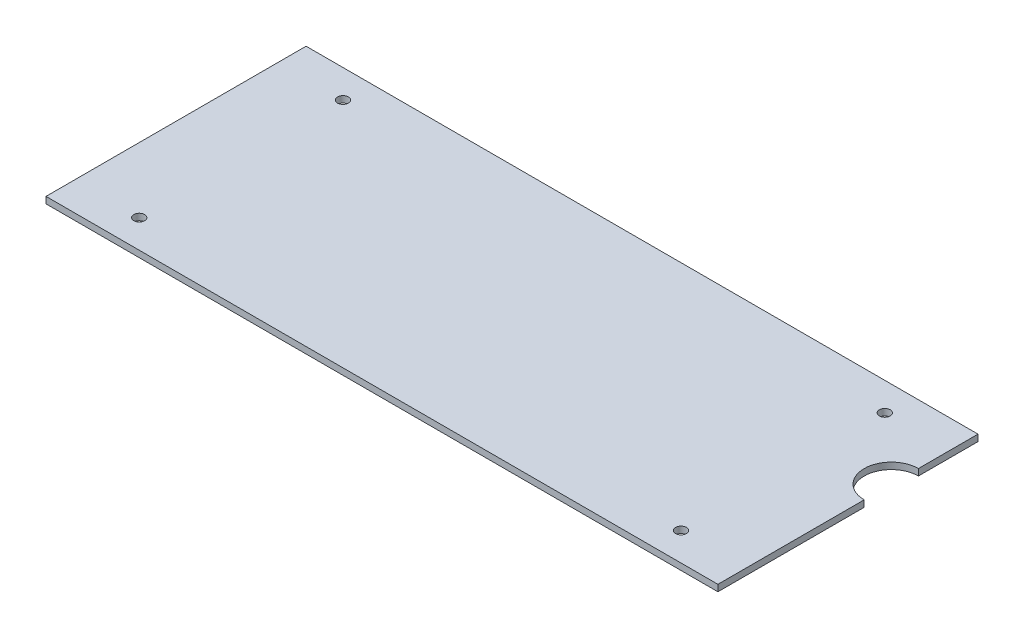
ISO-10303-21;
HEADER;
FILE_DESCRIPTION(('STEP AP214'),'2;1');
FILE_NAME('part.step','',(''),(''),'','','');
FILE_SCHEMA(('AUTOMOTIVE_DESIGN { 1 0 10303 214 1 1 1 1 }'));
ENDSEC;
DATA;
#1=APPLICATION_CONTEXT('core data for automotive mechanical design processes');
#2=APPLICATION_PROTOCOL_DEFINITION('international standard','automotive_design',2000,#1);
#3=PRODUCT_CONTEXT('',#1,'mechanical');
#4=PRODUCT('Part','Part','',(#3));
#5=PRODUCT_RELATED_PRODUCT_CATEGORY('part','',(#4));
#6=PRODUCT_DEFINITION_FORMATION('','',#4);
#7=PRODUCT_DEFINITION_CONTEXT('part definition',#1,'design');
#8=PRODUCT_DEFINITION('design','',#6,#7);
#9=PRODUCT_DEFINITION_SHAPE('','',#8);
#10=(LENGTH_UNIT() NAMED_UNIT(*) SI_UNIT(.MILLI.,.METRE.));
#11=(NAMED_UNIT(*) PLANE_ANGLE_UNIT() SI_UNIT($,.RADIAN.));
#12=(NAMED_UNIT(*) SI_UNIT($,.STERADIAN.) SOLID_ANGLE_UNIT());
#13=UNCERTAINTY_MEASURE_WITH_UNIT(LENGTH_MEASURE(1.E-05),#10,'distance_accuracy_value','');
#14=(GEOMETRIC_REPRESENTATION_CONTEXT(3) GLOBAL_UNCERTAINTY_ASSIGNED_CONTEXT((#13)) GLOBAL_UNIT_ASSIGNED_CONTEXT((#10,
#11,#12)) REPRESENTATION_CONTEXT('',''));
#15=CARTESIAN_POINT('',(0.,0.,0.));
#16=DIRECTION('',(0.,0.,1.));
#17=DIRECTION('',(1.,0.,0.));
#18=AXIS2_PLACEMENT_3D('',#15,#16,#17);
#19=CARTESIAN_POINT('',(155.,3.,60.));
#20=DIRECTION('',(-1.,0.,0.));
#21=DIRECTION('',(0.,0.,1.));
#22=AXIS2_PLACEMENT_3D('',#19,#20,#21);
#23=PLANE('',#22);
#24=DIRECTION('',(0.,0.,-1.));
#25=VECTOR('',#24,1.);
#26=CARTESIAN_POINT('',(155.,3.,60.));
#27=LINE('',#26,#25);
#28=CARTESIAN_POINT('',(155.,3.,-32.5));
#29=VERTEX_POINT('',#28);
#30=CARTESIAN_POINT('',(155.,3.,-60.));
#31=VERTEX_POINT('',#30);
#32=EDGE_CURVE('E84',#29,#31,#27,.T.);
#33=ORIENTED_EDGE('',*,*,#32,.F.);
#34=DIRECTION('',(0.,-1.,0.));
#35=VECTOR('',#34,1.);
#36=CARTESIAN_POINT('',(155.,3.001,-32.5));
#37=LINE('',#36,#35);
#38=CARTESIAN_POINT('',(155.,0.,-32.5));
#39=VERTEX_POINT('',#38);
#40=EDGE_CURVE('E96',#39,#29,#37,.F.);
#41=ORIENTED_EDGE('',*,*,#40,.F.);
#42=DIRECTION('',(0.,0.,-1.));
#43=VECTOR('',#42,1.);
#44=CARTESIAN_POINT('',(155.,0.,60.));
#45=LINE('',#44,#43);
#46=CARTESIAN_POINT('',(155.,0.,-60.));
#47=VERTEX_POINT('',#46);
#48=EDGE_CURVE('E105',#39,#47,#45,.T.);
#49=ORIENTED_EDGE('',*,*,#48,.T.);
#50=DIRECTION('',(0.,-1.,0.));
#51=VECTOR('',#50,1.);
#52=CARTESIAN_POINT('',(155.,3.,-60.));
#53=LINE('',#52,#51);
#54=EDGE_CURVE('E11',#31,#47,#53,.T.);
#55=ORIENTED_EDGE('',*,*,#54,.F.);
#56=EDGE_LOOP('',(#33,#41,#49,#55));
#57=FACE_BOUND('',#56,.T.);
#58=ADVANCED_FACE('F33',(#57),#23,.F.);
#59=CARTESIAN_POINT('',(0.,3.,0.));
#60=DIRECTION('',(0.,-1.,0.));
#61=DIRECTION('',(0.,0.,-1.));
#62=AXIS2_PLACEMENT_3D('',#59,#60,#61);
#63=PLANE('',#62);
#64=CARTESIAN_POINT('',(155.,3.,60.));
#65=VERTEX_POINT('',#64);
#66=CARTESIAN_POINT('',(155.,3.,-7.5));
#67=VERTEX_POINT('',#66);
#68=EDGE_CURVE('E138',#65,#67,#27,.T.);
#69=ORIENTED_EDGE('',*,*,#68,.T.);
#70=CARTESIAN_POINT('',(155.,3.,-20.));
#71=DIRECTION('',(0.,-1.,0.));
#72=DIRECTION('',(0.,0.,-1.));
#73=AXIS2_PLACEMENT_3D('',#70,#71,#72);
#74=CIRCLE('',#73,12.5);
#75=EDGE_CURVE('E48',#29,#67,#74,.F.);
#76=ORIENTED_EDGE('',*,*,#75,.F.);
#77=ORIENTED_EDGE('',*,*,#32,.T.);
#78=DIRECTION('',(-1.,0.,0.));
#79=VECTOR('',#78,1.);
#80=CARTESIAN_POINT('',(-155.,3.,-60.));
#81=LINE('',#80,#79);
#82=CARTESIAN_POINT('',(-155.,3.,-60.));
#83=VERTEX_POINT('',#82);
#84=EDGE_CURVE('E140',#31,#83,#81,.T.);
#85=ORIENTED_EDGE('',*,*,#84,.T.);
#86=DIRECTION('',(0.,0.,1.));
#87=VECTOR('',#86,1.);
#88=CARTESIAN_POINT('',(-155.,3.,60.));
#89=LINE('',#88,#87);
#90=CARTESIAN_POINT('',(-155.,3.,60.));
#91=VERTEX_POINT('',#90);
#92=EDGE_CURVE('E134',#83,#91,#89,.T.);
#93=ORIENTED_EDGE('',*,*,#92,.T.);
#94=DIRECTION('',(1.,0.,0.));
#95=VECTOR('',#94,1.);
#96=CARTESIAN_POINT('',(-155.,3.,60.));
#97=LINE('',#96,#95);
#98=EDGE_CURVE('E57',#91,#65,#97,.T.);
#99=ORIENTED_EDGE('',*,*,#98,.T.);
#100=EDGE_LOOP('',(#69,#76,#77,#85,#93,#99));
#101=FACE_BOUND('',#100,.T.);
#102=CARTESIAN_POINT('',(-125.,3.,-47.));
#103=DIRECTION('',(0.,1.,0.));
#104=DIRECTION('',(0.,0.,1.));
#105=AXIS2_PLACEMENT_3D('',#102,#103,#104);
#106=CIRCLE('',#105,2.5);
#107=CARTESIAN_POINT('',(-125.,3.,-44.5));
#108=VERTEX_POINT('',#107);
#109=EDGE_CURVE('E113',#108,#108,#106,.T.);
#110=ORIENTED_EDGE('',*,*,#109,.F.);
#111=EDGE_LOOP('',(#110));
#112=FACE_BOUND('',#111,.T.);
#113=CARTESIAN_POINT('',(125.,3.,-47.));
#114=DIRECTION('',(0.,1.,0.));
#115=DIRECTION('',(0.,0.,-1.));
#116=AXIS2_PLACEMENT_3D('',#113,#114,#115);
#117=CIRCLE('',#116,2.5);
#118=CARTESIAN_POINT('',(125.,3.,-49.5));
#119=VERTEX_POINT('',#118);
#120=EDGE_CURVE('E145',#119,#119,#117,.T.);
#121=ORIENTED_EDGE('',*,*,#120,.F.);
#122=EDGE_LOOP('',(#121));
#123=FACE_BOUND('',#122,.T.);
#124=CARTESIAN_POINT('',(125.,3.,47.));
#125=DIRECTION('',(0.,1.,0.));
#126=DIRECTION('',(0.,0.,1.));
#127=AXIS2_PLACEMENT_3D('',#124,#125,#126);
#128=CIRCLE('',#127,2.5);
#129=CARTESIAN_POINT('',(125.,3.,49.5));
#130=VERTEX_POINT('',#129);
#131=EDGE_CURVE('E150',#130,#130,#128,.T.);
#132=ORIENTED_EDGE('',*,*,#131,.F.);
#133=EDGE_LOOP('',(#132));
#134=FACE_BOUND('',#133,.T.);
#135=CARTESIAN_POINT('',(-125.,3.,47.));
#136=DIRECTION('',(0.,1.,0.));
#137=DIRECTION('',(0.,0.,-1.));
#138=AXIS2_PLACEMENT_3D('',#135,#136,#137);
#139=CIRCLE('',#138,2.5);
#140=CARTESIAN_POINT('',(-125.,3.,44.5));
#141=VERTEX_POINT('',#140);
#142=EDGE_CURVE('E156',#141,#141,#139,.T.);
#143=ORIENTED_EDGE('',*,*,#142,.F.);
#144=EDGE_LOOP('',(#143));
#145=FACE_BOUND('',#144,.T.);
#146=ADVANCED_FACE('F170',(#101,#112,#123,#134,#145),#63,.F.);
#147=CARTESIAN_POINT('',(0.,0.,0.));
#148=DIRECTION('',(0.,-1.,0.));
#149=DIRECTION('',(0.,0.,-1.));
#150=AXIS2_PLACEMENT_3D('',#147,#148,#149);
#151=PLANE('',#150);
#152=CARTESIAN_POINT('',(155.,0.,-20.));
#153=DIRECTION('',(0.,-1.,0.));
#154=DIRECTION('',(0.,0.,-1.));
#155=AXIS2_PLACEMENT_3D('',#152,#153,#154);
#156=CIRCLE('',#155,12.5);
#157=CARTESIAN_POINT('',(155.,0.,-7.49999999999999));
#158=VERTEX_POINT('',#157);
#159=EDGE_CURVE('E93',#158,#39,#156,.T.);
#160=ORIENTED_EDGE('',*,*,#159,.F.);
#161=CARTESIAN_POINT('',(155.,0.,60.));
#162=VERTEX_POINT('',#161);
#163=EDGE_CURVE('E112',#162,#158,#45,.T.);
#164=ORIENTED_EDGE('',*,*,#163,.F.);
#165=DIRECTION('',(1.,0.,0.));
#166=VECTOR('',#165,1.);
#167=CARTESIAN_POINT('',(-155.,0.,60.));
#168=LINE('',#167,#166);
#169=CARTESIAN_POINT('',(-155.,0.,60.));
#170=VERTEX_POINT('',#169);
#171=EDGE_CURVE('E78',#170,#162,#168,.T.);
#172=ORIENTED_EDGE('',*,*,#171,.F.);
#173=DIRECTION('',(0.,0.,1.));
#174=VECTOR('',#173,1.);
#175=CARTESIAN_POINT('',(-155.,0.,60.));
#176=LINE('',#175,#174);
#177=CARTESIAN_POINT('',(-155.,0.,-60.));
#178=VERTEX_POINT('',#177);
#179=EDGE_CURVE('E122',#178,#170,#176,.T.);
#180=ORIENTED_EDGE('',*,*,#179,.F.);
#181=DIRECTION('',(-1.,0.,0.));
#182=VECTOR('',#181,1.);
#183=CARTESIAN_POINT('',(-155.,0.,-60.));
#184=LINE('',#183,#182);
#185=EDGE_CURVE('E111',#47,#178,#184,.T.);
#186=ORIENTED_EDGE('',*,*,#185,.F.);
#187=ORIENTED_EDGE('',*,*,#48,.F.);
#188=EDGE_LOOP('',(#160,#164,#172,#180,#186,#187));
#189=FACE_BOUND('',#188,.T.);
#190=CARTESIAN_POINT('',(125.,0.,47.));
#191=DIRECTION('',(0.,1.,0.));
#192=DIRECTION('',(0.,0.,1.));
#193=AXIS2_PLACEMENT_3D('',#190,#191,#192);
#194=CIRCLE('',#193,2.5);
#195=CARTESIAN_POINT('',(125.,0.,49.5));
#196=VERTEX_POINT('',#195);
#197=EDGE_CURVE('E153',#196,#196,#194,.T.);
#198=ORIENTED_EDGE('',*,*,#197,.T.);
#199=EDGE_LOOP('',(#198));
#200=FACE_BOUND('',#199,.T.);
#201=CARTESIAN_POINT('',(-125.,0.,-47.));
#202=DIRECTION('',(0.,1.,0.));
#203=DIRECTION('',(0.,0.,1.));
#204=AXIS2_PLACEMENT_3D('',#201,#202,#203);
#205=CIRCLE('',#204,2.5);
#206=CARTESIAN_POINT('',(-125.,0.,-44.5));
#207=VERTEX_POINT('',#206);
#208=EDGE_CURVE('E116',#207,#207,#205,.T.);
#209=ORIENTED_EDGE('',*,*,#208,.T.);
#210=EDGE_LOOP('',(#209));
#211=FACE_BOUND('',#210,.T.);
#212=CARTESIAN_POINT('',(125.,0.,-47.));
#213=DIRECTION('',(0.,1.,0.));
#214=DIRECTION('',(0.,0.,-1.));
#215=AXIS2_PLACEMENT_3D('',#212,#213,#214);
#216=CIRCLE('',#215,2.5);
#217=CARTESIAN_POINT('',(125.,0.,-49.5));
#218=VERTEX_POINT('',#217);
#219=EDGE_CURVE('E147',#218,#218,#216,.T.);
#220=ORIENTED_EDGE('',*,*,#219,.T.);
#221=EDGE_LOOP('',(#220));
#222=FACE_BOUND('',#221,.T.);
#223=CARTESIAN_POINT('',(-125.,0.,47.));
#224=DIRECTION('',(0.,1.,0.));
#225=DIRECTION('',(0.,0.,-1.));
#226=AXIS2_PLACEMENT_3D('',#223,#224,#225);
#227=CIRCLE('',#226,2.5);
#228=CARTESIAN_POINT('',(-125.,0.,44.5));
#229=VERTEX_POINT('',#228);
#230=EDGE_CURVE('E159',#229,#229,#227,.T.);
#231=ORIENTED_EDGE('',*,*,#230,.T.);
#232=EDGE_LOOP('',(#231));
#233=FACE_BOUND('',#232,.T.);
#234=ADVANCED_FACE('F108',(#189,#200,#211,#222,#233),#151,.T.);
#235=ORIENTED_EDGE('',*,*,#163,.T.);
#236=DIRECTION('',(0.,-1.,0.));
#237=VECTOR('',#236,1.);
#238=CARTESIAN_POINT('',(155.,3.001,-7.49999999999999));
#239=LINE('',#238,#237);
#240=EDGE_CURVE('E97',#67,#158,#239,.T.);
#241=ORIENTED_EDGE('',*,*,#240,.F.);
#242=ORIENTED_EDGE('',*,*,#68,.F.);
#243=DIRECTION('',(0.,-1.,0.));
#244=VECTOR('',#243,1.);
#245=CARTESIAN_POINT('',(155.,3.,60.));
#246=LINE('',#245,#244);
#247=EDGE_CURVE('E125',#65,#162,#246,.T.);
#248=ORIENTED_EDGE('',*,*,#247,.T.);
#249=EDGE_LOOP('',(#235,#241,#242,#248));
#250=FACE_BOUND('',#249,.T.);
#251=ADVANCED_FACE('F35',(#250),#23,.F.);
#252=CARTESIAN_POINT('',(-155.,3.,-60.));
#253=DIRECTION('',(0.,0.,1.));
#254=DIRECTION('',(1.,0.,0.));
#255=AXIS2_PLACEMENT_3D('',#252,#253,#254);
#256=PLANE('',#255);
#257=ORIENTED_EDGE('',*,*,#185,.T.);
#258=DIRECTION('',(0.,-1.,0.));
#259=VECTOR('',#258,1.);
#260=CARTESIAN_POINT('',(-155.,3.,-60.));
#261=LINE('',#260,#259);
#262=EDGE_CURVE('E41',#83,#178,#261,.T.);
#263=ORIENTED_EDGE('',*,*,#262,.F.);
#264=ORIENTED_EDGE('',*,*,#84,.F.);
#265=ORIENTED_EDGE('',*,*,#54,.T.);
#266=EDGE_LOOP('',(#257,#263,#264,#265));
#267=FACE_BOUND('',#266,.T.);
#268=ADVANCED_FACE('F186',(#267),#256,.F.);
#269=CARTESIAN_POINT('',(-155.,3.,60.));
#270=DIRECTION('',(1.,0.,0.));
#271=DIRECTION('',(0.,0.,-1.));
#272=AXIS2_PLACEMENT_3D('',#269,#270,#271);
#273=PLANE('',#272);
#274=ORIENTED_EDGE('',*,*,#179,.T.);
#275=DIRECTION('',(0.,-1.,0.));
#276=VECTOR('',#275,1.);
#277=CARTESIAN_POINT('',(-155.,3.,60.));
#278=LINE('',#277,#276);
#279=EDGE_CURVE('E127',#91,#170,#278,.T.);
#280=ORIENTED_EDGE('',*,*,#279,.F.);
#281=ORIENTED_EDGE('',*,*,#92,.F.);
#282=ORIENTED_EDGE('',*,*,#262,.T.);
#283=EDGE_LOOP('',(#274,#280,#281,#282));
#284=FACE_BOUND('',#283,.T.);
#285=ADVANCED_FACE('F132',(#284),#273,.F.);
#286=CARTESIAN_POINT('',(-155.,3.,60.));
#287=DIRECTION('',(0.,0.,-1.));
#288=DIRECTION('',(-1.,0.,0.));
#289=AXIS2_PLACEMENT_3D('',#286,#287,#288);
#290=PLANE('',#289);
#291=ORIENTED_EDGE('',*,*,#171,.T.);
#292=ORIENTED_EDGE('',*,*,#247,.F.);
#293=ORIENTED_EDGE('',*,*,#98,.F.);
#294=ORIENTED_EDGE('',*,*,#279,.T.);
#295=EDGE_LOOP('',(#291,#292,#293,#294));
#296=FACE_BOUND('',#295,.T.);
#297=ADVANCED_FACE('F139',(#296),#290,.F.);
#298=CARTESIAN_POINT('',(-125.,3.,-47.));
#299=DIRECTION('',(0.,-1.,0.));
#300=DIRECTION('',(0.,0.,-1.));
#301=AXIS2_PLACEMENT_3D('',#298,#299,#300);
#302=CYLINDRICAL_SURFACE('',#301,2.5);
#303=ORIENTED_EDGE('',*,*,#109,.T.);
#304=EDGE_LOOP('',(#303));
#305=FACE_BOUND('',#304,.T.);
#306=ORIENTED_EDGE('',*,*,#208,.F.);
#307=EDGE_LOOP('',(#306));
#308=FACE_BOUND('',#307,.T.);
#309=ADVANCED_FACE('F180',(#305,#308),#302,.F.);
#310=CARTESIAN_POINT('',(125.,3.,-47.));
#311=DIRECTION('',(0.,-1.,0.));
#312=DIRECTION('',(0.,0.,-1.));
#313=AXIS2_PLACEMENT_3D('',#310,#311,#312);
#314=CYLINDRICAL_SURFACE('',#313,2.5);
#315=ORIENTED_EDGE('',*,*,#120,.T.);
#316=EDGE_LOOP('',(#315));
#317=FACE_BOUND('',#316,.T.);
#318=ORIENTED_EDGE('',*,*,#219,.F.);
#319=EDGE_LOOP('',(#318));
#320=FACE_BOUND('',#319,.T.);
#321=ADVANCED_FACE('F221',(#317,#320),#314,.F.);
#322=CARTESIAN_POINT('',(125.,3.,47.));
#323=DIRECTION('',(0.,-1.,0.));
#324=DIRECTION('',(0.,0.,-1.));
#325=AXIS2_PLACEMENT_3D('',#322,#323,#324);
#326=CYLINDRICAL_SURFACE('',#325,2.5);
#327=ORIENTED_EDGE('',*,*,#131,.T.);
#328=EDGE_LOOP('',(#327));
#329=FACE_BOUND('',#328,.T.);
#330=ORIENTED_EDGE('',*,*,#197,.F.);
#331=EDGE_LOOP('',(#330));
#332=FACE_BOUND('',#331,.T.);
#333=ADVANCED_FACE('F215',(#329,#332),#326,.F.);
#334=CARTESIAN_POINT('',(-125.,3.,47.));
#335=DIRECTION('',(0.,-1.,0.));
#336=DIRECTION('',(0.,0.,-1.));
#337=AXIS2_PLACEMENT_3D('',#334,#335,#336);
#338=CYLINDRICAL_SURFACE('',#337,2.5);
#339=ORIENTED_EDGE('',*,*,#142,.T.);
#340=EDGE_LOOP('',(#339));
#341=FACE_BOUND('',#340,.T.);
#342=ORIENTED_EDGE('',*,*,#230,.F.);
#343=EDGE_LOOP('',(#342));
#344=FACE_BOUND('',#343,.T.);
#345=ADVANCED_FACE('F167',(#341,#344),#338,.F.);
#346=CARTESIAN_POINT('',(155.,3.001,-20.));
#347=DIRECTION('',(0.,-1.,0.));
#348=DIRECTION('',(0.,0.,-1.));
#349=AXIS2_PLACEMENT_3D('',#346,#347,#348);
#350=CYLINDRICAL_SURFACE('',#349,12.5);
#351=ORIENTED_EDGE('',*,*,#40,.T.);
#352=ORIENTED_EDGE('',*,*,#75,.T.);
#353=ORIENTED_EDGE('',*,*,#240,.T.);
#354=ORIENTED_EDGE('',*,*,#159,.T.);
#355=EDGE_LOOP('',(#351,#352,#353,#354));
#356=FACE_BOUND('',#355,.T.);
#357=ADVANCED_FACE('F95',(#356),#350,.F.);
#358=CLOSED_SHELL('',(#58,#146,#234,#251,#268,#285,#297,#309,#321,#333,#345,#357));
#359=MANIFOLD_SOLID_BREP('B2',#358);
#360=ADVANCED_BREP_SHAPE_REPRESENTATION('',(#18,#359),#14);
#361=SHAPE_DEFINITION_REPRESENTATION(#9,#360);
ENDSEC;
END-ISO-10303-21;
